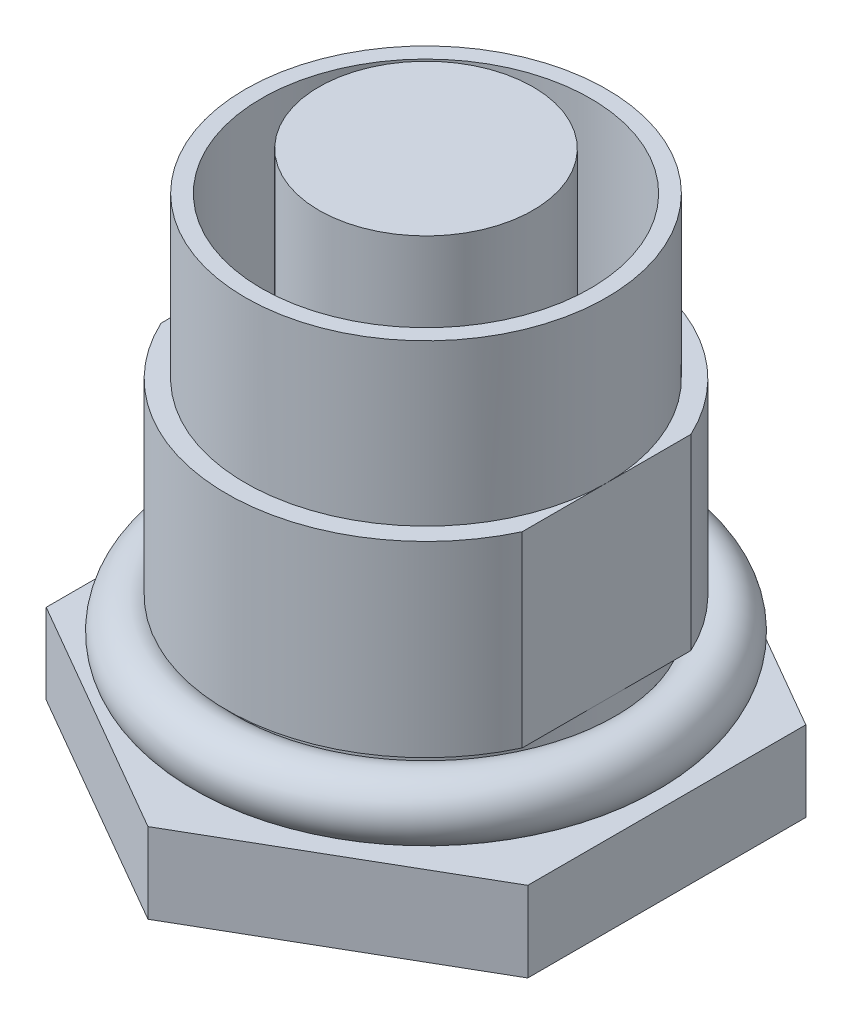
ISO-10303-21;
HEADER;
FILE_DESCRIPTION(('STEP AP214'),'2;1');
FILE_NAME('part.step','',(''),(''),'','','');
FILE_SCHEMA(('AUTOMOTIVE_DESIGN { 1 0 10303 214 1 1 1 1 }'));
ENDSEC;
DATA;
#1=APPLICATION_CONTEXT('core data for automotive mechanical design processes');
#2=APPLICATION_PROTOCOL_DEFINITION('international standard','automotive_design',2000,#1);
#3=PRODUCT_CONTEXT('',#1,'mechanical');
#4=PRODUCT('Part','Part','',(#3));
#5=PRODUCT_RELATED_PRODUCT_CATEGORY('part','',(#4));
#6=PRODUCT_DEFINITION_FORMATION('','',#4);
#7=PRODUCT_DEFINITION_CONTEXT('part definition',#1,'design');
#8=PRODUCT_DEFINITION('design','',#6,#7);
#9=PRODUCT_DEFINITION_SHAPE('','',#8);
#10=(LENGTH_UNIT() NAMED_UNIT(*) SI_UNIT(.MILLI.,.METRE.));
#11=(NAMED_UNIT(*) PLANE_ANGLE_UNIT() SI_UNIT($,.RADIAN.));
#12=(NAMED_UNIT(*) SI_UNIT($,.STERADIAN.) SOLID_ANGLE_UNIT());
#13=UNCERTAINTY_MEASURE_WITH_UNIT(LENGTH_MEASURE(1.E-05),#10,'distance_accuracy_value','');
#14=(GEOMETRIC_REPRESENTATION_CONTEXT(3) GLOBAL_UNCERTAINTY_ASSIGNED_CONTEXT((#13)) GLOBAL_UNIT_ASSIGNED_CONTEXT((#10,
#11,#12)) REPRESENTATION_CONTEXT('',''));
#15=CARTESIAN_POINT('',(0.,0.,0.));
#16=DIRECTION('',(0.,0.,1.));
#17=DIRECTION('',(1.,0.,0.));
#18=AXIS2_PLACEMENT_3D('',#15,#16,#17);
#19=CARTESIAN_POINT('',(0.,4.125,0.));
#20=DIRECTION('',(0.,-1.,0.));
#21=DIRECTION('',(0.,0.,-1.));
#22=AXIS2_PLACEMENT_3D('',#19,#20,#21);
#23=TOROIDAL_SURFACE('',#22,7.875,1.125);
#24=CARTESIAN_POINT('',(0.,4.125,-9.));
#25=VERTEX_POINT('',#24);
#26=VERTEX_LOOP('',#25);
#27=FACE_BOUND('',#26,.T.);
#28=ADVANCED_FACE('F52',(#27),#23,.T.);
#29=CLOSED_SHELL('',(#28));
#30=MANIFOLD_SOLID_BREP('B2',#29);
#31=CARTESIAN_POINT('',(0.,18.3,0.));
#32=DIRECTION('',(0.,-1.,0.));
#33=DIRECTION('',(0.,0.,-1.));
#34=AXIS2_PLACEMENT_3D('',#31,#32,#33);
#35=CYLINDRICAL_SURFACE('',#34,6.75);
#36=CARTESIAN_POINT('',(0.,3.,0.));
#37=DIRECTION('',(0.,-1.,0.));
#38=DIRECTION('',(0.,0.,-1.));
#39=AXIS2_PLACEMENT_3D('',#36,#37,#38);
#40=CIRCLE('',#39,6.75);
#41=CARTESIAN_POINT('',(0.,3.,-6.75));
#42=VERTEX_POINT('',#41);
#43=EDGE_CURVE('E78',#42,#42,#40,.T.);
#44=ORIENTED_EDGE('',*,*,#43,.F.);
#45=EDGE_LOOP('',(#44));
#46=FACE_BOUND('',#45,.T.);
#47=CARTESIAN_POINT('',(0.,5.3,0.));
#48=DIRECTION('',(0.,1.,0.));
#49=DIRECTION('',(0.,0.,1.));
#50=AXIS2_PLACEMENT_3D('',#47,#48,#49);
#51=CIRCLE('',#50,6.75);
#52=CARTESIAN_POINT('',(-6.75,5.3,0.));
#53=VERTEX_POINT('',#52);
#54=CARTESIAN_POINT('',(6.75,5.3,0.));
#55=VERTEX_POINT('',#54);
#56=EDGE_CURVE('E206',#53,#55,#51,.T.);
#57=ORIENTED_EDGE('',*,*,#56,.F.);
#58=CARTESIAN_POINT('',(0.,5.3,0.));
#59=DIRECTION('',(0.,1.,0.));
#60=DIRECTION('',(0.,0.,1.));
#61=AXIS2_PLACEMENT_3D('',#58,#59,#60);
#62=CIRCLE('',#61,6.75);
#63=EDGE_CURVE('E209',#55,#53,#62,.T.);
#64=ORIENTED_EDGE('',*,*,#63,.F.);
#65=EDGE_LOOP('',(#57,#64));
#66=FACE_BOUND('',#65,.T.);
#67=ADVANCED_FACE('F70',(#46,#66),#35,.T.);
#68=CARTESIAN_POINT('',(0.,18.3,0.));
#69=DIRECTION('',(0.,1.,0.));
#70=DIRECTION('',(0.,0.,1.));
#71=AXIS2_PLACEMENT_3D('',#68,#69,#70);
#72=CIRCLE('',#71,6.75);
#73=CARTESIAN_POINT('',(0.,18.3,6.75));
#74=VERTEX_POINT('',#73);
#75=EDGE_CURVE('E189',#74,#74,#72,.T.);
#76=ORIENTED_EDGE('',*,*,#75,.F.);
#77=EDGE_LOOP('',(#76));
#78=FACE_BOUND('',#77,.T.);
#79=CARTESIAN_POINT('',(0.,12.3,0.));
#80=DIRECTION('',(0.,1.,0.));
#81=DIRECTION('',(0.,0.,1.));
#82=AXIS2_PLACEMENT_3D('',#79,#80,#81);
#83=CIRCLE('',#82,6.75);
#84=CARTESIAN_POINT('',(6.75,12.3,0.));
#85=VERTEX_POINT('',#84);
#86=CARTESIAN_POINT('',(-6.75,12.3,0.));
#87=VERTEX_POINT('',#86);
#88=EDGE_CURVE('E252',#85,#87,#83,.T.);
#89=ORIENTED_EDGE('',*,*,#88,.T.);
#90=CARTESIAN_POINT('',(0.,12.3,0.));
#91=DIRECTION('',(0.,1.,0.));
#92=DIRECTION('',(0.,0.,1.));
#93=AXIS2_PLACEMENT_3D('',#90,#91,#92);
#94=CIRCLE('',#93,6.75);
#95=EDGE_CURVE('E434',#87,#85,#94,.T.);
#96=ORIENTED_EDGE('',*,*,#95,.T.);
#97=EDGE_LOOP('',(#89,#96));
#98=FACE_BOUND('',#97,.T.);
#99=ADVANCED_FACE('F72',(#78,#98),#35,.T.);
#100=CARTESIAN_POINT('',(0.,18.3,0.));
#101=DIRECTION('',(0.,1.,0.));
#102=DIRECTION('',(0.,0.,1.));
#103=AXIS2_PLACEMENT_3D('',#100,#101,#102);
#104=PLANE('',#103);
#105=CARTESIAN_POINT('',(0.,18.3,0.));
#106=DIRECTION('',(0.,1.,0.));
#107=DIRECTION('',(0.,0.,1.));
#108=AXIS2_PLACEMENT_3D('',#105,#106,#107);
#109=CIRCLE('',#108,6.15);
#110=CARTESIAN_POINT('',(0.,18.3,6.15));
#111=VERTEX_POINT('',#110);
#112=EDGE_CURVE('E261',#111,#111,#109,.T.);
#113=ORIENTED_EDGE('',*,*,#112,.F.);
#114=EDGE_LOOP('',(#113));
#115=FACE_BOUND('',#114,.T.);
#116=ORIENTED_EDGE('',*,*,#75,.T.);
#117=EDGE_LOOP('',(#116));
#118=FACE_BOUND('',#117,.T.);
#119=ADVANCED_FACE('F279',(#115,#118),#104,.T.);
#120=CARTESIAN_POINT('',(8.99999999999999,3.,5.19615242270664));
#121=DIRECTION('',(0.5,0.,0.866025403784439));
#122=DIRECTION('',(0.866025403784439,0.,-0.5));
#123=AXIS2_PLACEMENT_3D('',#120,#121,#122);
#124=PLANE('',#123);
#125=DIRECTION('',(-0.866025403784439,0.,0.5));
#126=VECTOR('',#125,1.);
#127=CARTESIAN_POINT('',(8.99999999999999,0.,5.19615242270664));
#128=LINE('',#127,#126);
#129=CARTESIAN_POINT('',(8.99999999999999,0.,5.19615242270664));
#130=VERTEX_POINT('',#129);
#131=CARTESIAN_POINT('',(0.,0.,10.3923048454133));
#132=VERTEX_POINT('',#131);
#133=EDGE_CURVE('E171',#130,#132,#128,.T.);
#134=ORIENTED_EDGE('',*,*,#133,.F.);
#135=DIRECTION('',(0.,-1.,0.));
#136=VECTOR('',#135,1.);
#137=CARTESIAN_POINT('',(8.99999999999999,3.,5.19615242270664));
#138=LINE('',#137,#136);
#139=CARTESIAN_POINT('',(8.99999999999999,3.,5.19615242270664));
#140=VERTEX_POINT('',#139);
#141=EDGE_CURVE('E94',#140,#130,#138,.T.);
#142=ORIENTED_EDGE('',*,*,#141,.F.);
#143=DIRECTION('',(-0.866025403784439,0.,0.5));
#144=VECTOR('',#143,1.);
#145=CARTESIAN_POINT('',(8.99999999999999,3.,5.19615242270664));
#146=LINE('',#145,#144);
#147=CARTESIAN_POINT('',(0.,3.,10.3923048454133));
#148=VERTEX_POINT('',#147);
#149=EDGE_CURVE('E187',#140,#148,#146,.T.);
#150=ORIENTED_EDGE('',*,*,#149,.T.);
#151=DIRECTION('',(0.,-1.,0.));
#152=VECTOR('',#151,1.);
#153=CARTESIAN_POINT('',(0.,3.,10.3923048454133));
#154=LINE('',#153,#152);
#155=EDGE_CURVE('E127',#148,#132,#154,.T.);
#156=ORIENTED_EDGE('',*,*,#155,.T.);
#157=EDGE_LOOP('',(#134,#142,#150,#156));
#158=FACE_BOUND('',#157,.T.);
#159=ADVANCED_FACE('F268',(#158),#124,.T.);
#160=CARTESIAN_POINT('',(9.,3.,-5.19615242270663));
#161=DIRECTION('',(1.,0.,0.));
#162=DIRECTION('',(0.,0.,-1.));
#163=AXIS2_PLACEMENT_3D('',#160,#161,#162);
#164=PLANE('',#163);
#165=DIRECTION('',(0.,0.,1.));
#166=VECTOR('',#165,1.);
#167=CARTESIAN_POINT('',(9.,0.,-5.19615242270663));
#168=LINE('',#167,#166);
#169=CARTESIAN_POINT('',(9.,0.,-5.19615242270663));
#170=VERTEX_POINT('',#169);
#171=EDGE_CURVE('E184',#170,#130,#168,.T.);
#172=ORIENTED_EDGE('',*,*,#171,.F.);
#173=DIRECTION('',(0.,-1.,0.));
#174=VECTOR('',#173,1.);
#175=CARTESIAN_POINT('',(9.,3.,-5.19615242270663));
#176=LINE('',#175,#174);
#177=CARTESIAN_POINT('',(9.,3.,-5.19615242270663));
#178=VERTEX_POINT('',#177);
#179=EDGE_CURVE('E152',#178,#170,#176,.T.);
#180=ORIENTED_EDGE('',*,*,#179,.F.);
#181=DIRECTION('',(0.,0.,1.));
#182=VECTOR('',#181,1.);
#183=CARTESIAN_POINT('',(9.,3.,-5.19615242270663));
#184=LINE('',#183,#182);
#185=EDGE_CURVE('E161',#178,#140,#184,.T.);
#186=ORIENTED_EDGE('',*,*,#185,.T.);
#187=ORIENTED_EDGE('',*,*,#141,.T.);
#188=EDGE_LOOP('',(#172,#180,#186,#187));
#189=FACE_BOUND('',#188,.T.);
#190=ADVANCED_FACE('F271',(#189),#164,.T.);
#191=CARTESIAN_POINT('',(0.,3.,-10.3923048454133));
#192=DIRECTION('',(0.5,0.,-0.866025403784439));
#193=DIRECTION('',(-0.866025403784439,0.,-0.5));
#194=AXIS2_PLACEMENT_3D('',#191,#192,#193);
#195=PLANE('',#194);
#196=DIRECTION('',(0.866025403784439,0.,0.5));
#197=VECTOR('',#196,1.);
#198=CARTESIAN_POINT('',(0.,0.,-10.3923048454133));
#199=LINE('',#198,#197);
#200=CARTESIAN_POINT('',(0.,0.,-10.3923048454133));
#201=VERTEX_POINT('',#200);
#202=EDGE_CURVE('E147',#201,#170,#199,.T.);
#203=ORIENTED_EDGE('',*,*,#202,.F.);
#204=DIRECTION('',(0.,-1.,0.));
#205=VECTOR('',#204,1.);
#206=CARTESIAN_POINT('',(0.,3.,-10.3923048454133));
#207=LINE('',#206,#205);
#208=CARTESIAN_POINT('',(0.,3.,-10.3923048454133));
#209=VERTEX_POINT('',#208);
#210=EDGE_CURVE('E141',#209,#201,#207,.T.);
#211=ORIENTED_EDGE('',*,*,#210,.F.);
#212=DIRECTION('',(0.866025403784439,0.,0.5));
#213=VECTOR('',#212,1.);
#214=CARTESIAN_POINT('',(0.,3.,-10.3923048454133));
#215=LINE('',#214,#213);
#216=EDGE_CURVE('E144',#209,#178,#215,.T.);
#217=ORIENTED_EDGE('',*,*,#216,.T.);
#218=ORIENTED_EDGE('',*,*,#179,.T.);
#219=EDGE_LOOP('',(#203,#211,#217,#218));
#220=FACE_BOUND('',#219,.T.);
#221=ADVANCED_FACE('F143',(#220),#195,.T.);
#222=CARTESIAN_POINT('',(-8.99999999999999,3.,-5.19615242270663));
#223=DIRECTION('',(-0.5,0.,-0.866025403784439));
#224=DIRECTION('',(-0.866025403784439,0.,0.5));
#225=AXIS2_PLACEMENT_3D('',#222,#223,#224);
#226=PLANE('',#225);
#227=DIRECTION('',(0.866025403784439,0.,-0.5));
#228=VECTOR('',#227,1.);
#229=CARTESIAN_POINT('',(-8.99999999999999,0.,-5.19615242270663));
#230=LINE('',#229,#228);
#231=CARTESIAN_POINT('',(-8.99999999999999,0.,-5.19615242270663));
#232=VERTEX_POINT('',#231);
#233=EDGE_CURVE('E181',#232,#201,#230,.T.);
#234=ORIENTED_EDGE('',*,*,#233,.F.);
#235=DIRECTION('',(0.,-1.,0.));
#236=VECTOR('',#235,1.);
#237=CARTESIAN_POINT('',(-8.99999999999999,3.,-5.19615242270663));
#238=LINE('',#237,#236);
#239=CARTESIAN_POINT('',(-8.99999999999999,3.,-5.19615242270663));
#240=VERTEX_POINT('',#239);
#241=EDGE_CURVE('E153',#240,#232,#238,.T.);
#242=ORIENTED_EDGE('',*,*,#241,.F.);
#243=DIRECTION('',(0.866025403784439,0.,-0.5));
#244=VECTOR('',#243,1.);
#245=CARTESIAN_POINT('',(-8.99999999999999,3.,-5.19615242270663));
#246=LINE('',#245,#244);
#247=EDGE_CURVE('E159',#240,#209,#246,.T.);
#248=ORIENTED_EDGE('',*,*,#247,.T.);
#249=ORIENTED_EDGE('',*,*,#210,.T.);
#250=EDGE_LOOP('',(#234,#242,#248,#249));
#251=FACE_BOUND('',#250,.T.);
#252=ADVANCED_FACE('F163',(#251),#226,.T.);
#253=CARTESIAN_POINT('',(-9.,3.,5.19615242270663));
#254=DIRECTION('',(-1.,0.,0.));
#255=DIRECTION('',(0.,0.,1.));
#256=AXIS2_PLACEMENT_3D('',#253,#254,#255);
#257=PLANE('',#256);
#258=DIRECTION('',(0.,0.,-1.));
#259=VECTOR('',#258,1.);
#260=CARTESIAN_POINT('',(-9.,0.,5.19615242270663));
#261=LINE('',#260,#259);
#262=CARTESIAN_POINT('',(-9.,0.,5.19615242270663));
#263=VERTEX_POINT('',#262);
#264=EDGE_CURVE('E178',#263,#232,#261,.T.);
#265=ORIENTED_EDGE('',*,*,#264,.F.);
#266=DIRECTION('',(0.,-1.,0.));
#267=VECTOR('',#266,1.);
#268=CARTESIAN_POINT('',(-9.,3.,5.19615242270663));
#269=LINE('',#268,#267);
#270=CARTESIAN_POINT('',(-9.,3.,5.19615242270663));
#271=VERTEX_POINT('',#270);
#272=EDGE_CURVE('E192',#271,#263,#269,.T.);
#273=ORIENTED_EDGE('',*,*,#272,.F.);
#274=DIRECTION('',(0.,0.,-1.));
#275=VECTOR('',#274,1.);
#276=CARTESIAN_POINT('',(-9.,3.,5.19615242270663));
#277=LINE('',#276,#275);
#278=EDGE_CURVE('E164',#271,#240,#277,.T.);
#279=ORIENTED_EDGE('',*,*,#278,.T.);
#280=ORIENTED_EDGE('',*,*,#241,.T.);
#281=EDGE_LOOP('',(#265,#273,#279,#280));
#282=FACE_BOUND('',#281,.T.);
#283=ADVANCED_FACE('F286',(#282),#257,.T.);
#284=CARTESIAN_POINT('',(0.,3.,10.3923048454133));
#285=DIRECTION('',(-0.5,0.,0.866025403784439));
#286=DIRECTION('',(0.866025403784439,0.,0.5));
#287=AXIS2_PLACEMENT_3D('',#284,#285,#286);
#288=PLANE('',#287);
#289=DIRECTION('',(-0.866025403784438,0.,-0.5));
#290=VECTOR('',#289,1.);
#291=CARTESIAN_POINT('',(0.,0.,10.3923048454133));
#292=LINE('',#291,#290);
#293=EDGE_CURVE('E174',#132,#263,#292,.T.);
#294=ORIENTED_EDGE('',*,*,#293,.F.);
#295=ORIENTED_EDGE('',*,*,#155,.F.);
#296=DIRECTION('',(-0.866025403784438,0.,-0.5));
#297=VECTOR('',#296,1.);
#298=CARTESIAN_POINT('',(0.,3.,10.3923048454133));
#299=LINE('',#298,#297);
#300=EDGE_CURVE('E166',#148,#271,#299,.T.);
#301=ORIENTED_EDGE('',*,*,#300,.T.);
#302=ORIENTED_EDGE('',*,*,#272,.T.);
#303=EDGE_LOOP('',(#294,#295,#301,#302));
#304=FACE_BOUND('',#303,.T.);
#305=ADVANCED_FACE('F266',(#304),#288,.T.);
#306=CARTESIAN_POINT('',(0.,3.,0.));
#307=DIRECTION('',(0.,-1.,0.));
#308=DIRECTION('',(0.,0.,-1.));
#309=AXIS2_PLACEMENT_3D('',#306,#307,#308);
#310=PLANE('',#309);
#311=ORIENTED_EDGE('',*,*,#43,.T.);
#312=EDGE_LOOP('',(#311));
#313=FACE_BOUND('',#312,.T.);
#314=ORIENTED_EDGE('',*,*,#149,.F.);
#315=ORIENTED_EDGE('',*,*,#185,.F.);
#316=ORIENTED_EDGE('',*,*,#216,.F.);
#317=ORIENTED_EDGE('',*,*,#247,.F.);
#318=ORIENTED_EDGE('',*,*,#278,.F.);
#319=ORIENTED_EDGE('',*,*,#300,.F.);
#320=EDGE_LOOP('',(#314,#315,#316,#317,#318,#319));
#321=FACE_BOUND('',#320,.T.);
#322=ADVANCED_FACE('F157',(#313,#321),#310,.F.);
#323=CARTESIAN_POINT('',(0.,0.,0.));
#324=DIRECTION('',(0.,1.,0.));
#325=DIRECTION('',(0.,0.,1.));
#326=AXIS2_PLACEMENT_3D('',#323,#324,#325);
#327=PLANE('',#326);
#328=ORIENTED_EDGE('',*,*,#133,.T.);
#329=ORIENTED_EDGE('',*,*,#293,.T.);
#330=ORIENTED_EDGE('',*,*,#264,.T.);
#331=ORIENTED_EDGE('',*,*,#233,.T.);
#332=ORIENTED_EDGE('',*,*,#202,.T.);
#333=ORIENTED_EDGE('',*,*,#171,.T.);
#334=EDGE_LOOP('',(#328,#329,#330,#331,#332,#333));
#335=FACE_BOUND('',#334,.T.);
#336=ADVANCED_FACE('F270',(#335),#327,.F.);
#337=CARTESIAN_POINT('',(0.,3.,0.));
#338=DIRECTION('',(0.,-1.,0.));
#339=DIRECTION('',(0.,0.,-1.));
#340=AXIS2_PLACEMENT_3D('',#337,#338,#339);
#341=PLANE('',#340);
#342=CARTESIAN_POINT('',(0.,3.,0.));
#343=DIRECTION('',(0.,-1.,0.));
#344=DIRECTION('',(0.,0.,-1.));
#345=AXIS2_PLACEMENT_3D('',#342,#343,#344);
#346=CIRCLE('',#345,4.);
#347=CARTESIAN_POINT('',(0.,3.,-4.));
#348=VERTEX_POINT('',#347);
#349=EDGE_CURVE('E50',#348,#348,#346,.F.);
#350=ORIENTED_EDGE('',*,*,#349,.F.);
#351=EDGE_LOOP('',(#350));
#352=FACE_BOUND('',#351,.T.);
#353=CARTESIAN_POINT('',(0.,3.,0.));
#354=DIRECTION('',(0.,-1.,0.));
#355=DIRECTION('',(0.,0.,-1.));
#356=AXIS2_PLACEMENT_3D('',#353,#354,#355);
#357=CIRCLE('',#356,6.15);
#358=CARTESIAN_POINT('',(0.,3.,-6.15));
#359=VERTEX_POINT('',#358);
#360=EDGE_CURVE('E175',#359,#359,#357,.F.);
#361=ORIENTED_EDGE('',*,*,#360,.T.);
#362=EDGE_LOOP('',(#361));
#363=FACE_BOUND('',#362,.T.);
#364=ADVANCED_FACE('F295',(#352,#363),#341,.F.);
#365=CARTESIAN_POINT('',(0.,-14.3948268171891,0.));
#366=DIRECTION('',(0.,1.,0.));
#367=DIRECTION('',(0.,0.,1.));
#368=AXIS2_PLACEMENT_3D('',#365,#366,#367);
#369=CYLINDRICAL_SURFACE('',#368,6.15);
#370=ORIENTED_EDGE('',*,*,#112,.T.);
#371=EDGE_LOOP('',(#370));
#372=FACE_BOUND('',#371,.T.);
#373=ORIENTED_EDGE('',*,*,#360,.F.);
#374=EDGE_LOOP('',(#373));
#375=FACE_BOUND('',#374,.T.);
#376=ADVANCED_FACE('F300',(#372,#375),#369,.F.);
#377=CARTESIAN_POINT('',(0.,19.75,0.));
#378=DIRECTION('',(0.,-1.,0.));
#379=DIRECTION('',(0.,0.,-1.));
#380=AXIS2_PLACEMENT_3D('',#377,#378,#379);
#381=CYLINDRICAL_SURFACE('',#380,4.);
#382=CARTESIAN_POINT('',(0.,19.75,0.));
#383=DIRECTION('',(0.,1.,0.));
#384=DIRECTION('',(0.,0.,1.));
#385=AXIS2_PLACEMENT_3D('',#382,#383,#384);
#386=CIRCLE('',#385,4.);
#387=CARTESIAN_POINT('',(0.,19.75,4.));
#388=VERTEX_POINT('',#387);
#389=EDGE_CURVE('E256',#388,#388,#386,.T.);
#390=ORIENTED_EDGE('',*,*,#389,.F.);
#391=EDGE_LOOP('',(#390));
#392=FACE_BOUND('',#391,.T.);
#393=ORIENTED_EDGE('',*,*,#349,.T.);
#394=EDGE_LOOP('',(#393));
#395=FACE_BOUND('',#394,.T.);
#396=ADVANCED_FACE('F361',(#392,#395),#381,.T.);
#397=CARTESIAN_POINT('',(0.,19.75,0.));
#398=DIRECTION('',(0.,1.,0.));
#399=DIRECTION('',(0.,0.,1.));
#400=AXIS2_PLACEMENT_3D('',#397,#398,#399);
#401=PLANE('',#400);
#402=ORIENTED_EDGE('',*,*,#389,.T.);
#403=EDGE_LOOP('',(#402));
#404=FACE_BOUND('',#403,.T.);
#405=ADVANCED_FACE('F355',(#404),#401,.T.);
#406=CARTESIAN_POINT('',(6.75,5.3,0.));
#407=DIRECTION('',(1.,0.,0.));
#408=DIRECTION('',(0.,0.,-1.));
#409=AXIS2_PLACEMENT_3D('',#406,#407,#408);
#410=PLANE('',#409);
#411=DIRECTION('',(0.,0.,-1.));
#412=VECTOR('',#411,1.);
#413=CARTESIAN_POINT('',(6.75,12.3,0.));
#414=LINE('',#413,#412);
#415=CARTESIAN_POINT('',(6.75,12.3,-3.15277655408689));
#416=VERTEX_POINT('',#415);
#417=EDGE_CURVE('E243',#85,#416,#414,.T.);
#418=ORIENTED_EDGE('',*,*,#417,.F.);
#419=DIRECTION('',(0.,0.,1.));
#420=VECTOR('',#419,1.);
#421=CARTESIAN_POINT('',(6.75,12.3,0.));
#422=LINE('',#421,#420);
#423=CARTESIAN_POINT('',(6.75,12.3,3.15277655408689));
#424=VERTEX_POINT('',#423);
#425=EDGE_CURVE('E442',#85,#424,#422,.T.);
#426=ORIENTED_EDGE('',*,*,#425,.T.);
#427=DIRECTION('',(0.,1.,0.));
#428=VECTOR('',#427,1.);
#429=CARTESIAN_POINT('',(6.75,5.3,3.15277655408689));
#430=LINE('',#429,#428);
#431=CARTESIAN_POINT('',(6.75,5.3,3.15277655408689));
#432=VERTEX_POINT('',#431);
#433=EDGE_CURVE('E217',#432,#424,#430,.T.);
#434=ORIENTED_EDGE('',*,*,#433,.F.);
#435=DIRECTION('',(0.,0.,1.));
#436=VECTOR('',#435,1.);
#437=CARTESIAN_POINT('',(6.75,5.3,0.));
#438=LINE('',#437,#436);
#439=EDGE_CURVE('E216',#55,#432,#438,.T.);
#440=ORIENTED_EDGE('',*,*,#439,.F.);
#441=DIRECTION('',(0.,0.,-1.));
#442=VECTOR('',#441,1.);
#443=CARTESIAN_POINT('',(6.75,5.3,0.));
#444=LINE('',#443,#442);
#445=CARTESIAN_POINT('',(6.75,5.3,-3.15277655408689));
#446=VERTEX_POINT('',#445);
#447=EDGE_CURVE('E228',#55,#446,#444,.T.);
#448=ORIENTED_EDGE('',*,*,#447,.T.);
#449=DIRECTION('',(0.,1.,0.));
#450=VECTOR('',#449,1.);
#451=CARTESIAN_POINT('',(6.75,5.3,-3.15277655408689));
#452=LINE('',#451,#450);
#453=EDGE_CURVE('E229',#446,#416,#452,.T.);
#454=ORIENTED_EDGE('',*,*,#453,.T.);
#455=EDGE_LOOP('',(#418,#426,#434,#440,#448,#454));
#456=FACE_BOUND('',#455,.T.);
#457=ADVANCED_FACE('F360',(#456),#410,.T.);
#458=CARTESIAN_POINT('',(-6.75,5.3,0.));
#459=DIRECTION('',(1.,0.,0.));
#460=DIRECTION('',(0.,0.,-1.));
#461=AXIS2_PLACEMENT_3D('',#458,#459,#460);
#462=PLANE('',#461);
#463=DIRECTION('',(0.,0.,-1.));
#464=VECTOR('',#463,1.);
#465=CARTESIAN_POINT('',(-6.75,12.3,0.));
#466=LINE('',#465,#464);
#467=CARTESIAN_POINT('',(-6.75,12.3,-3.15277655408689));
#468=VERTEX_POINT('',#467);
#469=EDGE_CURVE('E250',#87,#468,#466,.T.);
#470=ORIENTED_EDGE('',*,*,#469,.T.);
#471=DIRECTION('',(0.,1.,0.));
#472=VECTOR('',#471,1.);
#473=CARTESIAN_POINT('',(-6.75,5.3,-3.15277655408689));
#474=LINE('',#473,#472);
#475=CARTESIAN_POINT('',(-6.75,5.3,-3.15277655408689));
#476=VERTEX_POINT('',#475);
#477=EDGE_CURVE('E236',#476,#468,#474,.T.);
#478=ORIENTED_EDGE('',*,*,#477,.F.);
#479=DIRECTION('',(0.,0.,-1.));
#480=VECTOR('',#479,1.);
#481=CARTESIAN_POINT('',(-6.75,5.3,0.));
#482=LINE('',#481,#480);
#483=EDGE_CURVE('E225',#53,#476,#482,.T.);
#484=ORIENTED_EDGE('',*,*,#483,.F.);
#485=DIRECTION('',(0.,0.,1.));
#486=VECTOR('',#485,1.);
#487=CARTESIAN_POINT('',(-6.75,5.3,0.));
#488=LINE('',#487,#486);
#489=CARTESIAN_POINT('',(-6.75,5.3,3.15277655408689));
#490=VERTEX_POINT('',#489);
#491=EDGE_CURVE('E234',#53,#490,#488,.T.);
#492=ORIENTED_EDGE('',*,*,#491,.T.);
#493=DIRECTION('',(0.,1.,0.));
#494=VECTOR('',#493,1.);
#495=CARTESIAN_POINT('',(-6.75,5.3,3.15277655408689));
#496=LINE('',#495,#494);
#497=CARTESIAN_POINT('',(-6.75,12.3,3.15277655408689));
#498=VERTEX_POINT('',#497);
#499=EDGE_CURVE('E424',#490,#498,#496,.T.);
#500=ORIENTED_EDGE('',*,*,#499,.T.);
#501=DIRECTION('',(0.,0.,1.));
#502=VECTOR('',#501,1.);
#503=CARTESIAN_POINT('',(-6.75,12.3,0.));
#504=LINE('',#503,#502);
#505=EDGE_CURVE('E85',#87,#498,#504,.T.);
#506=ORIENTED_EDGE('',*,*,#505,.F.);
#507=EDGE_LOOP('',(#470,#478,#484,#492,#500,#506));
#508=FACE_BOUND('',#507,.T.);
#509=ADVANCED_FACE('F232',(#508),#462,.F.);
#510=CARTESIAN_POINT('',(0.,5.3,0.));
#511=DIRECTION('',(0.,1.,0.));
#512=DIRECTION('',(0.,0.,1.));
#513=AXIS2_PLACEMENT_3D('',#510,#511,#512);
#514=CYLINDRICAL_SURFACE('',#513,7.45);
#515=CARTESIAN_POINT('',(0.,12.3,0.));
#516=DIRECTION('',(0.,1.,0.));
#517=DIRECTION('',(0.,0.,1.));
#518=AXIS2_PLACEMENT_3D('',#515,#516,#517);
#519=CIRCLE('',#518,7.45);
#520=EDGE_CURVE('E246',#416,#468,#519,.T.);
#521=ORIENTED_EDGE('',*,*,#520,.F.);
#522=ORIENTED_EDGE('',*,*,#453,.F.);
#523=CARTESIAN_POINT('',(0.,5.3,0.));
#524=DIRECTION('',(0.,1.,0.));
#525=DIRECTION('',(0.,0.,1.));
#526=AXIS2_PLACEMENT_3D('',#523,#524,#525);
#527=CIRCLE('',#526,7.45);
#528=EDGE_CURVE('E238',#446,#476,#527,.T.);
#529=ORIENTED_EDGE('',*,*,#528,.T.);
#530=ORIENTED_EDGE('',*,*,#477,.T.);
#531=EDGE_LOOP('',(#521,#522,#529,#530));
#532=FACE_BOUND('',#531,.T.);
#533=ADVANCED_FACE('F395',(#532),#514,.T.);
#534=CARTESIAN_POINT('',(0.,5.3,0.));
#535=DIRECTION('',(0.,1.,0.));
#536=DIRECTION('',(0.,0.,1.));
#537=AXIS2_PLACEMENT_3D('',#534,#535,#536);
#538=PLANE('',#537);
#539=ORIENTED_EDGE('',*,*,#447,.F.);
#540=ORIENTED_EDGE('',*,*,#63,.T.);
#541=ORIENTED_EDGE('',*,*,#483,.T.);
#542=ORIENTED_EDGE('',*,*,#528,.F.);
#543=EDGE_LOOP('',(#539,#540,#541,#542));
#544=FACE_BOUND('',#543,.T.);
#545=ADVANCED_FACE('F223',(#544),#538,.F.);
#546=CARTESIAN_POINT('',(0.,12.3,0.));
#547=DIRECTION('',(0.,1.,0.));
#548=DIRECTION('',(0.,0.,1.));
#549=AXIS2_PLACEMENT_3D('',#546,#547,#548);
#550=PLANE('',#549);
#551=ORIENTED_EDGE('',*,*,#417,.T.);
#552=ORIENTED_EDGE('',*,*,#520,.T.);
#553=ORIENTED_EDGE('',*,*,#469,.F.);
#554=ORIENTED_EDGE('',*,*,#88,.F.);
#555=EDGE_LOOP('',(#551,#552,#553,#554));
#556=FACE_BOUND('',#555,.T.);
#557=ADVANCED_FACE('F401',(#556),#550,.T.);
#558=CARTESIAN_POINT('',(0.,5.3,0.));
#559=DIRECTION('',(0.,1.,0.));
#560=DIRECTION('',(0.,0.,1.));
#561=AXIS2_PLACEMENT_3D('',#558,#559,#560);
#562=CYLINDRICAL_SURFACE('',#561,7.45);
#563=CARTESIAN_POINT('',(0.,12.3,0.));
#564=DIRECTION('',(0.,1.,0.));
#565=DIRECTION('',(0.,0.,1.));
#566=AXIS2_PLACEMENT_3D('',#563,#564,#565);
#567=CIRCLE('',#566,7.45);
#568=EDGE_CURVE('E247',#498,#424,#567,.T.);
#569=ORIENTED_EDGE('',*,*,#568,.F.);
#570=ORIENTED_EDGE('',*,*,#499,.F.);
#571=CARTESIAN_POINT('',(0.,5.3,0.));
#572=DIRECTION('',(0.,1.,0.));
#573=DIRECTION('',(0.,0.,1.));
#574=AXIS2_PLACEMENT_3D('',#571,#572,#573);
#575=CIRCLE('',#574,7.45);
#576=EDGE_CURVE('E440',#490,#432,#575,.T.);
#577=ORIENTED_EDGE('',*,*,#576,.T.);
#578=ORIENTED_EDGE('',*,*,#433,.T.);
#579=EDGE_LOOP('',(#569,#570,#577,#578));
#580=FACE_BOUND('',#579,.T.);
#581=ADVANCED_FACE('F404',(#580),#562,.T.);
#582=CARTESIAN_POINT('',(0.,5.3,0.));
#583=DIRECTION('',(0.,1.,0.));
#584=DIRECTION('',(0.,0.,1.));
#585=AXIS2_PLACEMENT_3D('',#582,#583,#584);
#586=PLANE('',#585);
#587=ORIENTED_EDGE('',*,*,#491,.F.);
#588=ORIENTED_EDGE('',*,*,#56,.T.);
#589=ORIENTED_EDGE('',*,*,#439,.T.);
#590=ORIENTED_EDGE('',*,*,#576,.F.);
#591=EDGE_LOOP('',(#587,#588,#589,#590));
#592=FACE_BOUND('',#591,.T.);
#593=ADVANCED_FACE('F408',(#592),#586,.F.);
#594=CARTESIAN_POINT('',(0.,12.3,0.));
#595=DIRECTION('',(0.,1.,0.));
#596=DIRECTION('',(0.,0.,1.));
#597=AXIS2_PLACEMENT_3D('',#594,#595,#596);
#598=PLANE('',#597);
#599=ORIENTED_EDGE('',*,*,#505,.T.);
#600=ORIENTED_EDGE('',*,*,#568,.T.);
#601=ORIENTED_EDGE('',*,*,#425,.F.);
#602=ORIENTED_EDGE('',*,*,#95,.F.);
#603=EDGE_LOOP('',(#599,#600,#601,#602));
#604=FACE_BOUND('',#603,.T.);
#605=ADVANCED_FACE('F411',(#604),#598,.T.);
#606=CLOSED_SHELL('',(#67,#99,#119,#159,#190,#221,#252,#283,#305,#322,#336,#364,#376,#396,#405,
#457,#509,#533,#545,#557,#581,#593,#605));
#607=MANIFOLD_SOLID_BREP('B8',#606);
#608=ADVANCED_BREP_SHAPE_REPRESENTATION('',(#18,#30,#607),#14);
#609=SHAPE_DEFINITION_REPRESENTATION(#9,#608);
ENDSEC;
END-ISO-10303-21;
